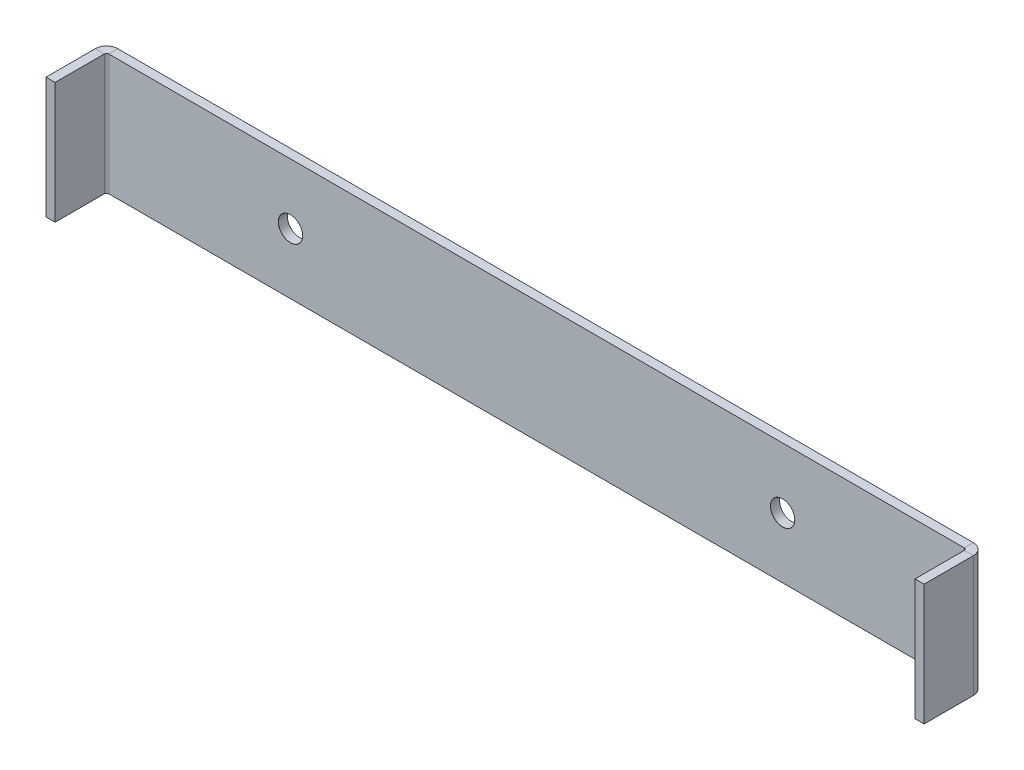
ISO-10303-21;
HEADER;
FILE_DESCRIPTION(('STEP AP214'),'2;1');
FILE_NAME('part.step','',(''),(''),'','','');
FILE_SCHEMA(('AUTOMOTIVE_DESIGN { 1 0 10303 214 1 1 1 1 }'));
ENDSEC;
DATA;
#1=APPLICATION_CONTEXT('core data for automotive mechanical design processes');
#2=APPLICATION_PROTOCOL_DEFINITION('international standard','automotive_design',2000,#1);
#3=PRODUCT_CONTEXT('',#1,'mechanical');
#4=PRODUCT('Part','Part','',(#3));
#5=PRODUCT_RELATED_PRODUCT_CATEGORY('part','',(#4));
#6=PRODUCT_DEFINITION_FORMATION('','',#4);
#7=PRODUCT_DEFINITION_CONTEXT('part definition',#1,'design');
#8=PRODUCT_DEFINITION('design','',#6,#7);
#9=PRODUCT_DEFINITION_SHAPE('','',#8);
#10=(LENGTH_UNIT() NAMED_UNIT(*) SI_UNIT(.MILLI.,.METRE.));
#11=(NAMED_UNIT(*) PLANE_ANGLE_UNIT() SI_UNIT($,.RADIAN.));
#12=(NAMED_UNIT(*) SI_UNIT($,.STERADIAN.) SOLID_ANGLE_UNIT());
#13=UNCERTAINTY_MEASURE_WITH_UNIT(LENGTH_MEASURE(1.E-05),#10,'distance_accuracy_value','');
#14=(GEOMETRIC_REPRESENTATION_CONTEXT(3) GLOBAL_UNCERTAINTY_ASSIGNED_CONTEXT((#13)) GLOBAL_UNIT_ASSIGNED_CONTEXT((#10,
#11,#12)) REPRESENTATION_CONTEXT('',''));
#15=CARTESIAN_POINT('',(0.,0.,0.));
#16=DIRECTION('',(0.,0.,1.));
#17=DIRECTION('',(1.,0.,0.));
#18=AXIS2_PLACEMENT_3D('',#15,#16,#17);
#19=CARTESIAN_POINT('',(0.,0.,-3.));
#20=DIRECTION('',(0.,0.,-1.));
#21=DIRECTION('',(-1.,0.,0.));
#22=AXIS2_PLACEMENT_3D('',#19,#20,#21);
#23=PLANE('',#22);
#24=CARTESIAN_POINT('',(226.2634,20.,-3.));
#25=DIRECTION('',(0.,0.,1.));
#26=DIRECTION('',(1.,0.,0.));
#27=AXIS2_PLACEMENT_3D('',#24,#25,#26);
#28=CIRCLE('',#27,4.);
#29=CARTESIAN_POINT('',(230.2634,20.,-3.));
#30=VERTEX_POINT('',#29);
#31=EDGE_CURVE('E309',#30,#30,#28,.T.);
#32=ORIENTED_EDGE('',*,*,#31,.T.);
#33=EDGE_LOOP('',(#32));
#34=FACE_BOUND('',#33,.T.);
#35=CARTESIAN_POINT('',(63.7366,20.,-3.));
#36=DIRECTION('',(0.,0.,1.));
#37=DIRECTION('',(1.,0.,0.));
#38=AXIS2_PLACEMENT_3D('',#35,#36,#37);
#39=CIRCLE('',#38,4.);
#40=CARTESIAN_POINT('',(67.7366,20.,-3.));
#41=VERTEX_POINT('',#40);
#42=EDGE_CURVE('E319',#41,#41,#39,.T.);
#43=ORIENTED_EDGE('',*,*,#42,.T.);
#44=EDGE_LOOP('',(#43));
#45=FACE_BOUND('',#44,.T.);
#46=DIRECTION('',(-1.,0.,0.));
#47=VECTOR('',#46,1.);
#48=CARTESIAN_POINT('',(0.,40.,-3.));
#49=LINE('',#48,#47);
#50=CARTESIAN_POINT('',(286.2634,40.,-3.));
#51=VERTEX_POINT('',#50);
#52=CARTESIAN_POINT('',(3.7366,40.,-3.));
#53=VERTEX_POINT('',#52);
#54=EDGE_CURVE('E13',#51,#53,#49,.T.);
#55=ORIENTED_EDGE('',*,*,#54,.F.);
#56=DIRECTION('',(0.,1.,0.));
#57=VECTOR('',#56,1.);
#58=CARTESIAN_POINT('',(286.2634,40.,-3.));
#59=LINE('',#58,#57);
#60=CARTESIAN_POINT('',(286.2634,0.,-3.));
#61=VERTEX_POINT('',#60);
#62=EDGE_CURVE('E359',#51,#61,#59,.F.);
#63=ORIENTED_EDGE('',*,*,#62,.T.);
#64=DIRECTION('',(1.,0.,0.));
#65=VECTOR('',#64,1.);
#66=CARTESIAN_POINT('',(0.,0.,-3.));
#67=LINE('',#66,#65);
#68=CARTESIAN_POINT('',(3.7366,0.,-3.));
#69=VERTEX_POINT('',#68);
#70=EDGE_CURVE('E92',#69,#61,#67,.T.);
#71=ORIENTED_EDGE('',*,*,#70,.F.);
#72=DIRECTION('',(0.,-1.,0.));
#73=VECTOR('',#72,1.);
#74=CARTESIAN_POINT('',(3.7366,0.,-3.));
#75=LINE('',#74,#73);
#76=EDGE_CURVE('E106',#69,#53,#75,.F.);
#77=ORIENTED_EDGE('',*,*,#76,.T.);
#78=EDGE_LOOP('',(#55,#63,#71,#77));
#79=FACE_BOUND('',#78,.T.);
#80=ADVANCED_FACE('F83',(#34,#45,#79),#23,.T.);
#81=CARTESIAN_POINT('',(0.,0.,0.));
#82=DIRECTION('',(0.,0.,-1.));
#83=DIRECTION('',(-1.,0.,0.));
#84=AXIS2_PLACEMENT_3D('',#81,#82,#83);
#85=PLANE('',#84);
#86=CARTESIAN_POINT('',(226.2634,20.,0.));
#87=DIRECTION('',(0.,0.,1.));
#88=DIRECTION('',(1.,0.,0.));
#89=AXIS2_PLACEMENT_3D('',#86,#87,#88);
#90=CIRCLE('',#89,4.025);
#91=CARTESIAN_POINT('',(230.2884,20.,0.));
#92=VERTEX_POINT('',#91);
#93=EDGE_CURVE('E307',#92,#92,#90,.T.);
#94=ORIENTED_EDGE('',*,*,#93,.F.);
#95=EDGE_LOOP('',(#94));
#96=FACE_BOUND('',#95,.T.);
#97=CARTESIAN_POINT('',(63.7366,20.,0.));
#98=DIRECTION('',(0.,0.,1.));
#99=DIRECTION('',(1.,0.,0.));
#100=AXIS2_PLACEMENT_3D('',#97,#98,#99);
#101=CIRCLE('',#100,4.025);
#102=CARTESIAN_POINT('',(67.7616,20.,0.));
#103=VERTEX_POINT('',#102);
#104=EDGE_CURVE('E313',#103,#103,#101,.T.);
#105=ORIENTED_EDGE('',*,*,#104,.F.);
#106=EDGE_LOOP('',(#105));
#107=FACE_BOUND('',#106,.T.);
#108=DIRECTION('',(0.,1.,0.));
#109=VECTOR('',#108,1.);
#110=CARTESIAN_POINT('',(286.2634,40.,0.));
#111=LINE('',#110,#109);
#112=CARTESIAN_POINT('',(286.2634,40.,0.));
#113=VERTEX_POINT('',#112);
#114=CARTESIAN_POINT('',(286.2634,0.,0.));
#115=VERTEX_POINT('',#114);
#116=EDGE_CURVE('E203',#113,#115,#111,.F.);
#117=ORIENTED_EDGE('',*,*,#116,.F.);
#118=DIRECTION('',(-1.,0.,0.));
#119=VECTOR('',#118,1.);
#120=CARTESIAN_POINT('',(0.,40.,0.));
#121=LINE('',#120,#119);
#122=CARTESIAN_POINT('',(3.7366,40.,0.));
#123=VERTEX_POINT('',#122);
#124=EDGE_CURVE('E87',#113,#123,#121,.T.);
#125=ORIENTED_EDGE('',*,*,#124,.T.);
#126=DIRECTION('',(0.,-1.,0.));
#127=VECTOR('',#126,1.);
#128=CARTESIAN_POINT('',(3.7366,0.,0.));
#129=LINE('',#128,#127);
#130=CARTESIAN_POINT('',(3.7366,0.,0.));
#131=VERTEX_POINT('',#130);
#132=EDGE_CURVE('E150',#131,#123,#129,.F.);
#133=ORIENTED_EDGE('',*,*,#132,.F.);
#134=DIRECTION('',(1.,0.,0.));
#135=VECTOR('',#134,1.);
#136=CARTESIAN_POINT('',(0.,0.,0.));
#137=LINE('',#136,#135);
#138=EDGE_CURVE('E191',#131,#115,#137,.T.);
#139=ORIENTED_EDGE('',*,*,#138,.T.);
#140=EDGE_LOOP('',(#117,#125,#133,#139));
#141=FACE_BOUND('',#140,.T.);
#142=ADVANCED_FACE('F200',(#96,#107,#141),#85,.F.);
#143=CARTESIAN_POINT('',(0.,40.,-3.));
#144=DIRECTION('',(0.,1.,0.));
#145=DIRECTION('',(0.,0.,1.));
#146=AXIS2_PLACEMENT_3D('',#143,#144,#145);
#147=PLANE('',#146);
#148=ORIENTED_EDGE('',*,*,#124,.F.);
#149=DIRECTION('',(0.,0.,-1.));
#150=VECTOR('',#149,1.);
#151=CARTESIAN_POINT('',(286.2634,40.,0.));
#152=LINE('',#151,#150);
#153=EDGE_CURVE('E366',#113,#51,#152,.T.);
#154=ORIENTED_EDGE('',*,*,#153,.T.);
#155=ORIENTED_EDGE('',*,*,#54,.T.);
#156=DIRECTION('',(0.,0.,-1.));
#157=VECTOR('',#156,1.);
#158=CARTESIAN_POINT('',(3.7366,40.,0.));
#159=LINE('',#158,#157);
#160=EDGE_CURVE('E188',#123,#53,#159,.T.);
#161=ORIENTED_EDGE('',*,*,#160,.F.);
#162=EDGE_LOOP('',(#148,#154,#155,#161));
#163=FACE_BOUND('',#162,.T.);
#164=ADVANCED_FACE('F206',(#163),#147,.T.);
#165=CARTESIAN_POINT('',(0.,0.,-3.));
#166=DIRECTION('',(0.,-1.,0.));
#167=DIRECTION('',(0.,0.,-1.));
#168=AXIS2_PLACEMENT_3D('',#165,#166,#167);
#169=PLANE('',#168);
#170=DIRECTION('',(0.,0.,-1.));
#171=VECTOR('',#170,1.);
#172=CARTESIAN_POINT('',(286.2634,0.,0.));
#173=LINE('',#172,#171);
#174=EDGE_CURVE('E179',#115,#61,#173,.T.);
#175=ORIENTED_EDGE('',*,*,#174,.F.);
#176=ORIENTED_EDGE('',*,*,#138,.F.);
#177=DIRECTION('',(0.,0.,-1.));
#178=VECTOR('',#177,1.);
#179=CARTESIAN_POINT('',(3.7366,0.,0.));
#180=LINE('',#179,#178);
#181=EDGE_CURVE('E149',#131,#69,#180,.T.);
#182=ORIENTED_EDGE('',*,*,#181,.T.);
#183=ORIENTED_EDGE('',*,*,#70,.T.);
#184=EDGE_LOOP('',(#175,#176,#182,#183));
#185=FACE_BOUND('',#184,.T.);
#186=ADVANCED_FACE('F85',(#185),#169,.T.);
#187=CARTESIAN_POINT('',(3.7366,40.,0.7366));
#188=DIRECTION('',(0.,1.,0.));
#189=DIRECTION('',(0.,0.,1.));
#190=AXIS2_PLACEMENT_3D('',#187,#188,#189);
#191=PLANE('',#190);
#192=DIRECTION('',(1.,0.,0.));
#193=VECTOR('',#192,1.);
#194=CARTESIAN_POINT('',(0.,40.,0.736599999999987));
#195=LINE('',#194,#193);
#196=CARTESIAN_POINT('',(3.,40.,0.736599999999997));
#197=VERTEX_POINT('',#196);
#198=CARTESIAN_POINT('',(0.,40.,0.736599999999987));
#199=VERTEX_POINT('',#198);
#200=EDGE_CURVE('E140',#197,#199,#195,.F.);
#201=ORIENTED_EDGE('',*,*,#200,.F.);
#202=CARTESIAN_POINT('',(3.7366,40.,0.7366));
#203=DIRECTION('',(0.,-1.,0.));
#204=DIRECTION('',(0.,0.,-1.));
#205=AXIS2_PLACEMENT_3D('',#202,#203,#204);
#206=CIRCLE('',#205,0.7366);
#207=EDGE_CURVE('E134',#123,#197,#206,.F.);
#208=ORIENTED_EDGE('',*,*,#207,.F.);
#209=ORIENTED_EDGE('',*,*,#160,.T.);
#210=CARTESIAN_POINT('',(3.7366,40.,0.7366));
#211=DIRECTION('',(0.,-1.,0.));
#212=DIRECTION('',(0.,0.,-1.));
#213=AXIS2_PLACEMENT_3D('',#210,#211,#212);
#214=CIRCLE('',#213,3.7366);
#215=EDGE_CURVE('E181',#53,#199,#214,.F.);
#216=ORIENTED_EDGE('',*,*,#215,.T.);
#217=EDGE_LOOP('',(#201,#208,#209,#216));
#218=FACE_BOUND('',#217,.T.);
#219=ADVANCED_FACE('F205',(#218),#191,.T.);
#220=CARTESIAN_POINT('',(3.7366,0.,0.7366));
#221=DIRECTION('',(0.,1.,0.));
#222=DIRECTION('',(0.,0.,1.));
#223=AXIS2_PLACEMENT_3D('',#220,#221,#222);
#224=PLANE('',#223);
#225=CARTESIAN_POINT('',(3.7366,0.,0.7366));
#226=DIRECTION('',(0.,-1.,0.));
#227=DIRECTION('',(0.,0.,-1.));
#228=AXIS2_PLACEMENT_3D('',#225,#226,#227);
#229=CIRCLE('',#228,0.7366);
#230=CARTESIAN_POINT('',(3.,0.,0.736599999999997));
#231=VERTEX_POINT('',#230);
#232=EDGE_CURVE('E131',#231,#131,#229,.T.);
#233=ORIENTED_EDGE('',*,*,#232,.F.);
#234=DIRECTION('',(1.,0.,0.));
#235=VECTOR('',#234,1.);
#236=CARTESIAN_POINT('',(3.,0.,0.736599999999997));
#237=LINE('',#236,#235);
#238=CARTESIAN_POINT('',(0.,0.,0.736599999999987));
#239=VERTEX_POINT('',#238);
#240=EDGE_CURVE('E139',#231,#239,#237,.F.);
#241=ORIENTED_EDGE('',*,*,#240,.T.);
#242=CARTESIAN_POINT('',(3.7366,0.,0.7366));
#243=DIRECTION('',(0.,-1.,0.));
#244=DIRECTION('',(0.,0.,-1.));
#245=AXIS2_PLACEMENT_3D('',#242,#243,#244);
#246=CIRCLE('',#245,3.7366);
#247=EDGE_CURVE('E182',#239,#69,#246,.T.);
#248=ORIENTED_EDGE('',*,*,#247,.T.);
#249=ORIENTED_EDGE('',*,*,#181,.F.);
#250=EDGE_LOOP('',(#233,#241,#248,#249));
#251=FACE_BOUND('',#250,.T.);
#252=ADVANCED_FACE('F145',(#251),#224,.F.);
#253=CARTESIAN_POINT('',(3.7366,0.,0.7366));
#254=DIRECTION('',(0.,-1.,0.));
#255=DIRECTION('',(-1.,0.,0.));
#256=AXIS2_PLACEMENT_3D('',#253,#254,#255);
#257=CYLINDRICAL_SURFACE('',#256,3.7366);
#258=ORIENTED_EDGE('',*,*,#76,.F.);
#259=ORIENTED_EDGE('',*,*,#247,.F.);
#260=DIRECTION('',(0.,-1.,0.));
#261=VECTOR('',#260,1.);
#262=CARTESIAN_POINT('',(0.,40.,0.736599999999987));
#263=LINE('',#262,#261);
#264=EDGE_CURVE('E163',#239,#199,#263,.F.);
#265=ORIENTED_EDGE('',*,*,#264,.T.);
#266=ORIENTED_EDGE('',*,*,#215,.F.);
#267=EDGE_LOOP('',(#258,#259,#265,#266));
#268=FACE_BOUND('',#267,.T.);
#269=ADVANCED_FACE('F227',(#268),#257,.T.);
#270=CARTESIAN_POINT('',(3.7366,0.,0.7366));
#271=DIRECTION('',(0.,-1.,0.));
#272=DIRECTION('',(-1.,0.,0.));
#273=AXIS2_PLACEMENT_3D('',#270,#271,#272);
#274=CYLINDRICAL_SURFACE('',#273,0.7366);
#275=ORIENTED_EDGE('',*,*,#132,.T.);
#276=ORIENTED_EDGE('',*,*,#207,.T.);
#277=DIRECTION('',(0.,-1.,0.));
#278=VECTOR('',#277,1.);
#279=CARTESIAN_POINT('',(3.,40.,0.736599999999997));
#280=LINE('',#279,#278);
#281=EDGE_CURVE('E127',#197,#231,#280,.T.);
#282=ORIENTED_EDGE('',*,*,#281,.T.);
#283=ORIENTED_EDGE('',*,*,#232,.T.);
#284=EDGE_LOOP('',(#275,#276,#282,#283));
#285=FACE_BOUND('',#284,.T.);
#286=ADVANCED_FACE('F130',(#285),#274,.F.);
#287=CARTESIAN_POINT('',(0.,40.,0.));
#288=DIRECTION('',(0.,-1.,0.));
#289=DIRECTION('',(0.,0.,-1.));
#290=AXIS2_PLACEMENT_3D('',#287,#288,#289);
#291=PLANE('',#290);
#292=ORIENTED_EDGE('',*,*,#200,.T.);
#293=DIRECTION('',(0.,0.,-1.));
#294=VECTOR('',#293,1.);
#295=CARTESIAN_POINT('',(0.,40.,0.));
#296=LINE('',#295,#294);
#297=CARTESIAN_POINT('',(0.,40.,17.));
#298=VERTEX_POINT('',#297);
#299=EDGE_CURVE('E171',#298,#199,#296,.T.);
#300=ORIENTED_EDGE('',*,*,#299,.F.);
#301=DIRECTION('',(1.,0.,0.));
#302=VECTOR('',#301,1.);
#303=CARTESIAN_POINT('',(0.,40.,17.));
#304=LINE('',#303,#302);
#305=CARTESIAN_POINT('',(2.99999999999994,40.,17.));
#306=VERTEX_POINT('',#305);
#307=EDGE_CURVE('E379',#298,#306,#304,.T.);
#308=ORIENTED_EDGE('',*,*,#307,.T.);
#309=DIRECTION('',(0.,0.,1.));
#310=VECTOR('',#309,1.);
#311=CARTESIAN_POINT('',(3.,40.,0.));
#312=LINE('',#311,#310);
#313=EDGE_CURVE('E169',#306,#197,#312,.F.);
#314=ORIENTED_EDGE('',*,*,#313,.T.);
#315=EDGE_LOOP('',(#292,#300,#308,#314));
#316=FACE_BOUND('',#315,.T.);
#317=ADVANCED_FACE('F232',(#316),#291,.F.);
#318=CARTESIAN_POINT('',(0.,0.,17.));
#319=DIRECTION('',(0.,1.,0.));
#320=DIRECTION('',(0.,0.,1.));
#321=AXIS2_PLACEMENT_3D('',#318,#319,#320);
#322=PLANE('',#321);
#323=ORIENTED_EDGE('',*,*,#240,.F.);
#324=DIRECTION('',(0.,0.,-1.));
#325=VECTOR('',#324,1.);
#326=CARTESIAN_POINT('',(2.99999999999994,0.,17.));
#327=LINE('',#326,#325);
#328=CARTESIAN_POINT('',(2.99999999999994,0.,17.));
#329=VERTEX_POINT('',#328);
#330=EDGE_CURVE('E159',#231,#329,#327,.F.);
#331=ORIENTED_EDGE('',*,*,#330,.T.);
#332=DIRECTION('',(1.,0.,0.));
#333=VECTOR('',#332,1.);
#334=CARTESIAN_POINT('',(0.,0.,17.));
#335=LINE('',#334,#333);
#336=CARTESIAN_POINT('',(0.,0.,17.));
#337=VERTEX_POINT('',#336);
#338=EDGE_CURVE('E151',#337,#329,#335,.T.);
#339=ORIENTED_EDGE('',*,*,#338,.F.);
#340=DIRECTION('',(0.,0.,1.));
#341=VECTOR('',#340,1.);
#342=CARTESIAN_POINT('',(0.,0.,0.));
#343=LINE('',#342,#341);
#344=EDGE_CURVE('E162',#239,#337,#343,.T.);
#345=ORIENTED_EDGE('',*,*,#344,.F.);
#346=EDGE_LOOP('',(#323,#331,#339,#345));
#347=FACE_BOUND('',#346,.T.);
#348=ADVANCED_FACE('F156',(#347),#322,.F.);
#349=CARTESIAN_POINT('',(0.,0.,0.));
#350=DIRECTION('',(1.,0.,0.));
#351=DIRECTION('',(0.,0.,-1.));
#352=AXIS2_PLACEMENT_3D('',#349,#350,#351);
#353=PLANE('',#352);
#354=ORIENTED_EDGE('',*,*,#264,.F.);
#355=ORIENTED_EDGE('',*,*,#344,.T.);
#356=DIRECTION('',(0.,1.,0.));
#357=VECTOR('',#356,1.);
#358=CARTESIAN_POINT('',(0.,0.,17.));
#359=LINE('',#358,#357);
#360=EDGE_CURVE('E382',#337,#298,#359,.T.);
#361=ORIENTED_EDGE('',*,*,#360,.T.);
#362=ORIENTED_EDGE('',*,*,#299,.T.);
#363=EDGE_LOOP('',(#354,#355,#361,#362));
#364=FACE_BOUND('',#363,.T.);
#365=ADVANCED_FACE('F240',(#364),#353,.F.);
#366=CARTESIAN_POINT('',(3.,0.,0.));
#367=DIRECTION('',(1.,0.,0.));
#368=DIRECTION('',(0.,0.,-1.));
#369=AXIS2_PLACEMENT_3D('',#366,#367,#368);
#370=PLANE('',#369);
#371=ORIENTED_EDGE('',*,*,#330,.F.);
#372=ORIENTED_EDGE('',*,*,#281,.F.);
#373=ORIENTED_EDGE('',*,*,#313,.F.);
#374=DIRECTION('',(0.,-1.,0.));
#375=VECTOR('',#374,1.);
#376=CARTESIAN_POINT('',(2.99999999999994,40.,17.));
#377=LINE('',#376,#375);
#378=EDGE_CURVE('E168',#329,#306,#377,.F.);
#379=ORIENTED_EDGE('',*,*,#378,.F.);
#380=EDGE_LOOP('',(#371,#372,#373,#379));
#381=FACE_BOUND('',#380,.T.);
#382=ADVANCED_FACE('F166',(#381),#370,.T.);
#383=CARTESIAN_POINT('',(0.,40.,17.));
#384=DIRECTION('',(0.,0.,-1.));
#385=DIRECTION('',(-1.,0.,0.));
#386=AXIS2_PLACEMENT_3D('',#383,#384,#385);
#387=PLANE('',#386);
#388=ORIENTED_EDGE('',*,*,#378,.T.);
#389=ORIENTED_EDGE('',*,*,#307,.F.);
#390=ORIENTED_EDGE('',*,*,#360,.F.);
#391=ORIENTED_EDGE('',*,*,#338,.T.);
#392=EDGE_LOOP('',(#388,#389,#390,#391));
#393=FACE_BOUND('',#392,.T.);
#394=ADVANCED_FACE('F241',(#393),#387,.F.);
#395=CARTESIAN_POINT('',(286.2634,0.,0.736599999999978));
#396=DIRECTION('',(0.,-1.,0.));
#397=DIRECTION('',(0.,0.,-1.));
#398=AXIS2_PLACEMENT_3D('',#395,#396,#397);
#399=PLANE('',#398);
#400=DIRECTION('',(-1.,0.,0.));
#401=VECTOR('',#400,1.);
#402=CARTESIAN_POINT('',(290.,0.,0.736599999999966));
#403=LINE('',#402,#401);
#404=CARTESIAN_POINT('',(287.,0.,0.736599999999976));
#405=VERTEX_POINT('',#404);
#406=CARTESIAN_POINT('',(290.,0.,0.736599999999966));
#407=VERTEX_POINT('',#406);
#408=EDGE_CURVE('E322',#405,#407,#403,.F.);
#409=ORIENTED_EDGE('',*,*,#408,.F.);
#410=CARTESIAN_POINT('',(286.2634,0.,0.736599999999978));
#411=DIRECTION('',(0.,1.,0.));
#412=DIRECTION('',(0.,0.,1.));
#413=AXIS2_PLACEMENT_3D('',#410,#411,#412);
#414=CIRCLE('',#413,0.736599999999976);
#415=EDGE_CURVE('E369',#115,#405,#414,.F.);
#416=ORIENTED_EDGE('',*,*,#415,.F.);
#417=ORIENTED_EDGE('',*,*,#174,.T.);
#418=CARTESIAN_POINT('',(286.2634,0.,0.736599999999978));
#419=DIRECTION('',(0.,1.,0.));
#420=DIRECTION('',(0.,0.,1.));
#421=AXIS2_PLACEMENT_3D('',#418,#419,#420);
#422=CIRCLE('',#421,3.73659999999998);
#423=EDGE_CURVE('E362',#61,#407,#422,.F.);
#424=ORIENTED_EDGE('',*,*,#423,.T.);
#425=EDGE_LOOP('',(#409,#416,#417,#424));
#426=FACE_BOUND('',#425,.T.);
#427=ADVANCED_FACE('F243',(#426),#399,.T.);
#428=CARTESIAN_POINT('',(286.2634,40.,0.736599999999978));
#429=DIRECTION('',(0.,-1.,0.));
#430=DIRECTION('',(0.,0.,-1.));
#431=AXIS2_PLACEMENT_3D('',#428,#429,#430);
#432=PLANE('',#431);
#433=CARTESIAN_POINT('',(286.2634,40.,0.736599999999978));
#434=DIRECTION('',(0.,1.,0.));
#435=DIRECTION('',(0.,0.,1.));
#436=AXIS2_PLACEMENT_3D('',#433,#434,#435);
#437=CIRCLE('',#436,0.736599999999976);
#438=CARTESIAN_POINT('',(287.,40.,0.736599999999976));
#439=VERTEX_POINT('',#438);
#440=EDGE_CURVE('E326',#439,#113,#437,.T.);
#441=ORIENTED_EDGE('',*,*,#440,.F.);
#442=DIRECTION('',(-1.,0.,0.));
#443=VECTOR('',#442,1.);
#444=CARTESIAN_POINT('',(287.,40.,0.736599999999976));
#445=LINE('',#444,#443);
#446=CARTESIAN_POINT('',(290.,40.,0.736599999999966));
#447=VERTEX_POINT('',#446);
#448=EDGE_CURVE('E351',#439,#447,#445,.F.);
#449=ORIENTED_EDGE('',*,*,#448,.T.);
#450=CARTESIAN_POINT('',(286.2634,40.,0.736599999999978));
#451=DIRECTION('',(0.,1.,0.));
#452=DIRECTION('',(0.,0.,1.));
#453=AXIS2_PLACEMENT_3D('',#450,#451,#452);
#454=CIRCLE('',#453,3.73659999999998);
#455=EDGE_CURVE('E363',#447,#51,#454,.T.);
#456=ORIENTED_EDGE('',*,*,#455,.T.);
#457=ORIENTED_EDGE('',*,*,#153,.F.);
#458=EDGE_LOOP('',(#441,#449,#456,#457));
#459=FACE_BOUND('',#458,.T.);
#460=ADVANCED_FACE('F250',(#459),#432,.F.);
#461=CARTESIAN_POINT('',(286.2634,40.,0.736599999999978));
#462=DIRECTION('',(0.,1.,0.));
#463=DIRECTION('',(1.,0.,0.));
#464=AXIS2_PLACEMENT_3D('',#461,#462,#463);
#465=CYLINDRICAL_SURFACE('',#464,3.73659999999998);
#466=ORIENTED_EDGE('',*,*,#62,.F.);
#467=ORIENTED_EDGE('',*,*,#455,.F.);
#468=DIRECTION('',(0.,1.,0.));
#469=VECTOR('',#468,1.);
#470=CARTESIAN_POINT('',(290.,0.,0.736599999999966));
#471=LINE('',#470,#469);
#472=EDGE_CURVE('E348',#447,#407,#471,.F.);
#473=ORIENTED_EDGE('',*,*,#472,.T.);
#474=ORIENTED_EDGE('',*,*,#423,.F.);
#475=EDGE_LOOP('',(#466,#467,#473,#474));
#476=FACE_BOUND('',#475,.T.);
#477=ADVANCED_FACE('F253',(#476),#465,.T.);
#478=CARTESIAN_POINT('',(286.2634,40.,0.736599999999978));
#479=DIRECTION('',(0.,1.,0.));
#480=DIRECTION('',(1.,0.,0.));
#481=AXIS2_PLACEMENT_3D('',#478,#479,#480);
#482=CYLINDRICAL_SURFACE('',#481,0.736599999999976);
#483=ORIENTED_EDGE('',*,*,#116,.T.);
#484=ORIENTED_EDGE('',*,*,#415,.T.);
#485=DIRECTION('',(0.,1.,0.));
#486=VECTOR('',#485,1.);
#487=CARTESIAN_POINT('',(287.,0.,0.736599999999976));
#488=LINE('',#487,#486);
#489=EDGE_CURVE('E354',#405,#439,#488,.T.);
#490=ORIENTED_EDGE('',*,*,#489,.T.);
#491=ORIENTED_EDGE('',*,*,#440,.T.);
#492=EDGE_LOOP('',(#483,#484,#490,#491));
#493=FACE_BOUND('',#492,.T.);
#494=ADVANCED_FACE('F258',(#493),#482,.F.);
#495=CARTESIAN_POINT('',(290.,0.,0.));
#496=DIRECTION('',(0.,1.,0.));
#497=DIRECTION('',(0.,0.,1.));
#498=AXIS2_PLACEMENT_3D('',#495,#496,#497);
#499=PLANE('',#498);
#500=ORIENTED_EDGE('',*,*,#408,.T.);
#501=DIRECTION('',(0.,0.,-1.));
#502=VECTOR('',#501,1.);
#503=CARTESIAN_POINT('',(290.,0.,-9.57429376785045E-13));
#504=LINE('',#503,#502);
#505=CARTESIAN_POINT('',(290.,0.,17.));
#506=VERTEX_POINT('',#505);
#507=EDGE_CURVE('E336',#506,#407,#504,.T.);
#508=ORIENTED_EDGE('',*,*,#507,.F.);
#509=DIRECTION('',(-1.,0.,0.));
#510=VECTOR('',#509,1.);
#511=CARTESIAN_POINT('',(290.,0.,17.));
#512=LINE('',#511,#510);
#513=CARTESIAN_POINT('',(287.,0.,17.));
#514=VERTEX_POINT('',#513);
#515=EDGE_CURVE('E327',#506,#514,#512,.T.);
#516=ORIENTED_EDGE('',*,*,#515,.T.);
#517=DIRECTION('',(0.,0.,1.));
#518=VECTOR('',#517,1.);
#519=CARTESIAN_POINT('',(287.,0.,0.));
#520=LINE('',#519,#518);
#521=EDGE_CURVE('E345',#514,#405,#520,.F.);
#522=ORIENTED_EDGE('',*,*,#521,.T.);
#523=EDGE_LOOP('',(#500,#508,#516,#522));
#524=FACE_BOUND('',#523,.T.);
#525=ADVANCED_FACE('F261',(#524),#499,.F.);
#526=CARTESIAN_POINT('',(290.,40.,17.));
#527=DIRECTION('',(0.,-1.,0.));
#528=DIRECTION('',(0.,0.,-1.));
#529=AXIS2_PLACEMENT_3D('',#526,#527,#528);
#530=PLANE('',#529);
#531=ORIENTED_EDGE('',*,*,#448,.F.);
#532=DIRECTION('',(0.,0.,-1.));
#533=VECTOR('',#532,1.);
#534=CARTESIAN_POINT('',(287.,40.,17.));
#535=LINE('',#534,#533);
#536=CARTESIAN_POINT('',(287.,40.,17.));
#537=VERTEX_POINT('',#536);
#538=EDGE_CURVE('E342',#439,#537,#535,.F.);
#539=ORIENTED_EDGE('',*,*,#538,.T.);
#540=DIRECTION('',(-1.,0.,0.));
#541=VECTOR('',#540,1.);
#542=CARTESIAN_POINT('',(290.,40.,17.));
#543=LINE('',#542,#541);
#544=CARTESIAN_POINT('',(290.,40.,17.));
#545=VERTEX_POINT('',#544);
#546=EDGE_CURVE('E323',#545,#537,#543,.T.);
#547=ORIENTED_EDGE('',*,*,#546,.F.);
#548=DIRECTION('',(0.,0.,1.));
#549=VECTOR('',#548,1.);
#550=CARTESIAN_POINT('',(290.,40.,-9.57429376785045E-13));
#551=LINE('',#550,#549);
#552=EDGE_CURVE('E333',#447,#545,#551,.T.);
#553=ORIENTED_EDGE('',*,*,#552,.F.);
#554=EDGE_LOOP('',(#531,#539,#547,#553));
#555=FACE_BOUND('',#554,.T.);
#556=ADVANCED_FACE('F268',(#555),#530,.F.);
#557=CARTESIAN_POINT('',(290.,0.,-9.57429376785045E-13));
#558=DIRECTION('',(-1.,0.,0.));
#559=DIRECTION('',(0.,0.,1.));
#560=AXIS2_PLACEMENT_3D('',#557,#558,#559);
#561=PLANE('',#560);
#562=ORIENTED_EDGE('',*,*,#472,.F.);
#563=ORIENTED_EDGE('',*,*,#552,.T.);
#564=DIRECTION('',(0.,-1.,0.));
#565=VECTOR('',#564,1.);
#566=CARTESIAN_POINT('',(290.,0.,17.));
#567=LINE('',#566,#565);
#568=EDGE_CURVE('E330',#545,#506,#567,.T.);
#569=ORIENTED_EDGE('',*,*,#568,.T.);
#570=ORIENTED_EDGE('',*,*,#507,.T.);
#571=EDGE_LOOP('',(#562,#563,#569,#570));
#572=FACE_BOUND('',#571,.T.);
#573=ADVANCED_FACE('F272',(#572),#561,.F.);
#574=CARTESIAN_POINT('',(287.,0.,-9.46954932768515E-13));
#575=DIRECTION('',(-1.,0.,0.));
#576=DIRECTION('',(0.,0.,1.));
#577=AXIS2_PLACEMENT_3D('',#574,#575,#576);
#578=PLANE('',#577);
#579=ORIENTED_EDGE('',*,*,#538,.F.);
#580=ORIENTED_EDGE('',*,*,#489,.F.);
#581=ORIENTED_EDGE('',*,*,#521,.F.);
#582=DIRECTION('',(0.,1.,0.));
#583=VECTOR('',#582,1.);
#584=CARTESIAN_POINT('',(287.,0.,17.));
#585=LINE('',#584,#583);
#586=EDGE_CURVE('E339',#537,#514,#585,.F.);
#587=ORIENTED_EDGE('',*,*,#586,.F.);
#588=EDGE_LOOP('',(#579,#580,#581,#587));
#589=FACE_BOUND('',#588,.T.);
#590=ADVANCED_FACE('F277',(#589),#578,.T.);
#591=CARTESIAN_POINT('',(290.,0.,17.));
#592=DIRECTION('',(0.,0.,-1.));
#593=DIRECTION('',(-1.,0.,0.));
#594=AXIS2_PLACEMENT_3D('',#591,#592,#593);
#595=PLANE('',#594);
#596=ORIENTED_EDGE('',*,*,#586,.T.);
#597=ORIENTED_EDGE('',*,*,#515,.F.);
#598=ORIENTED_EDGE('',*,*,#568,.F.);
#599=ORIENTED_EDGE('',*,*,#546,.T.);
#600=EDGE_LOOP('',(#596,#597,#598,#599));
#601=FACE_BOUND('',#600,.T.);
#602=ADVANCED_FACE('F274',(#601),#595,.F.);
#603=CARTESIAN_POINT('',(63.7366,20.,0.));
#604=DIRECTION('',(0.,0.,1.));
#605=DIRECTION('',(1.,0.,0.));
#606=AXIS2_PLACEMENT_3D('',#603,#604,#605);
#607=CYLINDRICAL_SURFACE('',#606,4.);
#608=ORIENTED_EDGE('',*,*,#42,.F.);
#609=EDGE_LOOP('',(#608));
#610=FACE_BOUND('',#609,.T.);
#611=CARTESIAN_POINT('',(63.7366,20.,-0.0250000000000007));
#612=DIRECTION('',(0.,0.,1.));
#613=DIRECTION('',(1.,0.,0.));
#614=AXIS2_PLACEMENT_3D('',#611,#612,#613);
#615=CIRCLE('',#614,4.);
#616=CARTESIAN_POINT('',(67.7366,20.,-0.0250000000000007));
#617=VERTEX_POINT('',#616);
#618=EDGE_CURVE('E316',#617,#617,#615,.T.);
#619=ORIENTED_EDGE('',*,*,#618,.T.);
#620=EDGE_LOOP('',(#619));
#621=FACE_BOUND('',#620,.T.);
#622=ADVANCED_FACE('F276',(#610,#621),#607,.F.);
#623=CARTESIAN_POINT('',(63.7366,20.,0.));
#624=DIRECTION('',(0.,0.,1.));
#625=DIRECTION('',(1.,0.,0.));
#626=AXIS2_PLACEMENT_3D('',#623,#624,#625);
#627=CONICAL_SURFACE('',#626,4.025,0.785398163397379);
#628=ORIENTED_EDGE('',*,*,#618,.F.);
#629=EDGE_LOOP('',(#628));
#630=FACE_BOUND('',#629,.T.);
#631=ORIENTED_EDGE('',*,*,#104,.T.);
#632=EDGE_LOOP('',(#631));
#633=FACE_BOUND('',#632,.T.);
#634=ADVANCED_FACE('F287',(#630,#633),#627,.F.);
#635=CARTESIAN_POINT('',(226.2634,20.,0.));
#636=DIRECTION('',(0.,0.,1.));
#637=DIRECTION('',(1.,0.,0.));
#638=AXIS2_PLACEMENT_3D('',#635,#636,#637);
#639=CYLINDRICAL_SURFACE('',#638,4.);
#640=ORIENTED_EDGE('',*,*,#31,.F.);
#641=EDGE_LOOP('',(#640));
#642=FACE_BOUND('',#641,.T.);
#643=CARTESIAN_POINT('',(226.2634,20.,-0.0250000000000007));
#644=DIRECTION('',(0.,0.,1.));
#645=DIRECTION('',(1.,0.,0.));
#646=AXIS2_PLACEMENT_3D('',#643,#644,#645);
#647=CIRCLE('',#646,4.);
#648=CARTESIAN_POINT('',(230.2634,20.,-0.0250000000000007));
#649=VERTEX_POINT('',#648);
#650=EDGE_CURVE('E304',#649,#649,#647,.T.);
#651=ORIENTED_EDGE('',*,*,#650,.T.);
#652=EDGE_LOOP('',(#651));
#653=FACE_BOUND('',#652,.T.);
#654=ADVANCED_FACE('F291',(#642,#653),#639,.F.);
#655=CARTESIAN_POINT('',(226.2634,20.,0.));
#656=DIRECTION('',(0.,0.,1.));
#657=DIRECTION('',(1.,0.,0.));
#658=AXIS2_PLACEMENT_3D('',#655,#656,#657);
#659=CONICAL_SURFACE('',#658,4.025,0.785398163397379);
#660=ORIENTED_EDGE('',*,*,#650,.F.);
#661=EDGE_LOOP('',(#660));
#662=FACE_BOUND('',#661,.T.);
#663=ORIENTED_EDGE('',*,*,#93,.T.);
#664=EDGE_LOOP('',(#663));
#665=FACE_BOUND('',#664,.T.);
#666=ADVANCED_FACE('F295',(#662,#665),#659,.F.);
#667=CLOSED_SHELL('',(#80,#142,#164,#186,#219,#252,#269,#286,#317,#348,#365,#382,#394,#427,#460,
#477,#494,#525,#556,#573,#590,#602,#622,#634,#654,#666));
#668=MANIFOLD_SOLID_BREP('B2',#667);
#669=ADVANCED_BREP_SHAPE_REPRESENTATION('',(#18,#668),#14);
#670=SHAPE_DEFINITION_REPRESENTATION(#9,#669);
ENDSEC;
END-ISO-10303-21;
